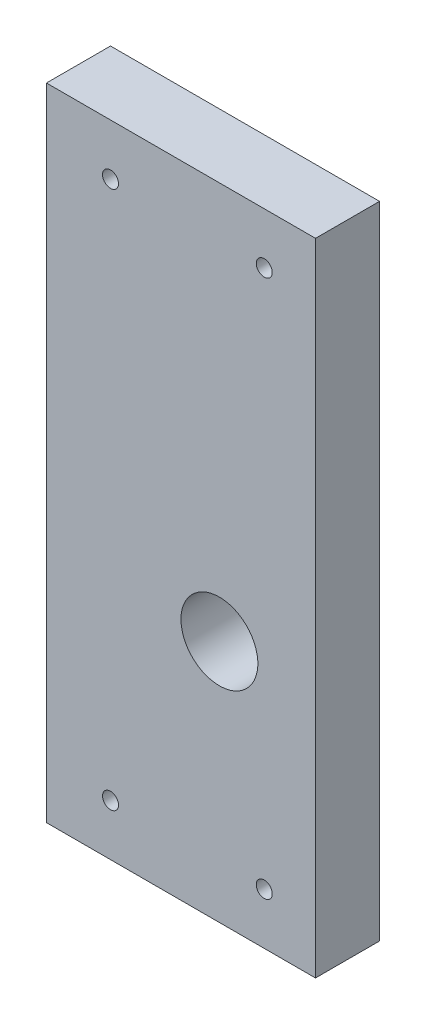
ISO-10303-21;
HEADER;
FILE_DESCRIPTION(('STEP AP214'),'2;1');
FILE_NAME('part.step','',(''),(''),'','','');
FILE_SCHEMA(('AUTOMOTIVE_DESIGN { 1 0 10303 214 1 1 1 1 }'));
ENDSEC;
DATA;
#1=APPLICATION_CONTEXT('core data for automotive mechanical design processes');
#2=APPLICATION_PROTOCOL_DEFINITION('international standard','automotive_design',2000,#1);
#3=PRODUCT_CONTEXT('',#1,'mechanical');
#4=PRODUCT('Part','Part','',(#3));
#5=PRODUCT_RELATED_PRODUCT_CATEGORY('part','',(#4));
#6=PRODUCT_DEFINITION_FORMATION('','',#4);
#7=PRODUCT_DEFINITION_CONTEXT('part definition',#1,'design');
#8=PRODUCT_DEFINITION('design','',#6,#7);
#9=PRODUCT_DEFINITION_SHAPE('','',#8);
#10=(LENGTH_UNIT() NAMED_UNIT(*) SI_UNIT(.MILLI.,.METRE.));
#11=(NAMED_UNIT(*) PLANE_ANGLE_UNIT() SI_UNIT($,.RADIAN.));
#12=(NAMED_UNIT(*) SI_UNIT($,.STERADIAN.) SOLID_ANGLE_UNIT());
#13=UNCERTAINTY_MEASURE_WITH_UNIT(LENGTH_MEASURE(1.E-05),#10,'distance_accuracy_value','');
#14=(GEOMETRIC_REPRESENTATION_CONTEXT(3) GLOBAL_UNCERTAINTY_ASSIGNED_CONTEXT((#13)) GLOBAL_UNIT_ASSIGNED_CONTEXT((#10,
#11,#12)) REPRESENTATION_CONTEXT('',''));
#15=CARTESIAN_POINT('',(0.,0.,0.));
#16=DIRECTION('',(0.,0.,1.));
#17=DIRECTION('',(1.,0.,0.));
#18=AXIS2_PLACEMENT_3D('',#15,#16,#17);
#19=CARTESIAN_POINT('',(21.,-50.,0.));
#20=DIRECTION('',(1.,0.,0.));
#21=DIRECTION('',(0.,0.,-1.));
#22=AXIS2_PLACEMENT_3D('',#19,#20,#21);
#23=PLANE('',#22);
#24=DIRECTION('',(0.,1.,0.));
#25=VECTOR('',#24,1.);
#26=CARTESIAN_POINT('',(21.,-50.,10.));
#27=LINE('',#26,#25);
#28=CARTESIAN_POINT('',(21.,-50.,10.));
#29=VERTEX_POINT('',#28);
#30=CARTESIAN_POINT('',(21.,50.,10.));
#31=VERTEX_POINT('',#30);
#32=EDGE_CURVE('E138',#29,#31,#27,.T.);
#33=ORIENTED_EDGE('',*,*,#32,.F.);
#34=DIRECTION('',(0.,0.,1.));
#35=VECTOR('',#34,1.);
#36=CARTESIAN_POINT('',(21.,-50.,0.));
#37=LINE('',#36,#35);
#38=CARTESIAN_POINT('',(21.,-50.,0.));
#39=VERTEX_POINT('',#38);
#40=EDGE_CURVE('E11',#39,#29,#37,.T.);
#41=ORIENTED_EDGE('',*,*,#40,.F.);
#42=DIRECTION('',(0.,1.,0.));
#43=VECTOR('',#42,1.);
#44=CARTESIAN_POINT('',(21.,-50.,0.));
#45=LINE('',#44,#43);
#46=CARTESIAN_POINT('',(21.,50.,0.));
#47=VERTEX_POINT('',#46);
#48=EDGE_CURVE('E139',#39,#47,#45,.T.);
#49=ORIENTED_EDGE('',*,*,#48,.T.);
#50=DIRECTION('',(0.,0.,1.));
#51=VECTOR('',#50,1.);
#52=CARTESIAN_POINT('',(21.,50.,0.));
#53=LINE('',#52,#51);
#54=EDGE_CURVE('E38',#47,#31,#53,.T.);
#55=ORIENTED_EDGE('',*,*,#54,.T.);
#56=EDGE_LOOP('',(#33,#41,#49,#55));
#57=FACE_BOUND('',#56,.T.);
#58=ADVANCED_FACE('F35',(#57),#23,.T.);
#59=CARTESIAN_POINT('',(-21.,-50.,0.));
#60=DIRECTION('',(0.,-1.,0.));
#61=DIRECTION('',(0.,0.,-1.));
#62=AXIS2_PLACEMENT_3D('',#59,#60,#61);
#63=PLANE('',#62);
#64=DIRECTION('',(1.,0.,0.));
#65=VECTOR('',#64,1.);
#66=CARTESIAN_POINT('',(-21.,-50.,10.));
#67=LINE('',#66,#65);
#68=CARTESIAN_POINT('',(-21.,-50.,10.));
#69=VERTEX_POINT('',#68);
#70=EDGE_CURVE('E142',#69,#29,#67,.T.);
#71=ORIENTED_EDGE('',*,*,#70,.F.);
#72=DIRECTION('',(0.,0.,1.));
#73=VECTOR('',#72,1.);
#74=CARTESIAN_POINT('',(-21.,-50.,0.));
#75=LINE('',#74,#73);
#76=CARTESIAN_POINT('',(-21.,-50.,0.));
#77=VERTEX_POINT('',#76);
#78=EDGE_CURVE('E44',#77,#69,#75,.T.);
#79=ORIENTED_EDGE('',*,*,#78,.F.);
#80=DIRECTION('',(1.,0.,0.));
#81=VECTOR('',#80,1.);
#82=CARTESIAN_POINT('',(-21.,-50.,0.));
#83=LINE('',#82,#81);
#84=EDGE_CURVE('E146',#77,#39,#83,.T.);
#85=ORIENTED_EDGE('',*,*,#84,.T.);
#86=ORIENTED_EDGE('',*,*,#40,.T.);
#87=EDGE_LOOP('',(#71,#79,#85,#86));
#88=FACE_BOUND('',#87,.T.);
#89=ADVANCED_FACE('F161',(#88),#63,.T.);
#90=CARTESIAN_POINT('',(-21.,50.,0.));
#91=DIRECTION('',(-1.,0.,0.));
#92=DIRECTION('',(0.,0.,1.));
#93=AXIS2_PLACEMENT_3D('',#90,#91,#92);
#94=PLANE('',#93);
#95=CARTESIAN_POINT('',(-21.,45.,5.));
#96=DIRECTION('',(-1.,0.,0.));
#97=DIRECTION('',(0.,0.,1.));
#98=AXIS2_PLACEMENT_3D('',#95,#96,#97);
#99=CIRCLE('',#98,1.24999999999999);
#100=CARTESIAN_POINT('',(-21.,45.,6.24999999999999));
#101=VERTEX_POINT('',#100);
#102=EDGE_CURVE('E98',#101,#101,#99,.T.);
#103=ORIENTED_EDGE('',*,*,#102,.F.);
#104=EDGE_LOOP('',(#103));
#105=FACE_BOUND('',#104,.T.);
#106=CARTESIAN_POINT('',(-21.,-45.,5.));
#107=DIRECTION('',(-1.,0.,0.));
#108=DIRECTION('',(0.,0.,1.));
#109=AXIS2_PLACEMENT_3D('',#106,#107,#108);
#110=CIRCLE('',#109,1.24999999999999);
#111=CARTESIAN_POINT('',(-21.,-45.,6.24999999999999));
#112=VERTEX_POINT('',#111);
#113=EDGE_CURVE('E97',#112,#112,#110,.T.);
#114=ORIENTED_EDGE('',*,*,#113,.F.);
#115=EDGE_LOOP('',(#114));
#116=FACE_BOUND('',#115,.T.);
#117=DIRECTION('',(0.,-1.,0.));
#118=VECTOR('',#117,1.);
#119=CARTESIAN_POINT('',(-21.,50.,10.));
#120=LINE('',#119,#118);
#121=CARTESIAN_POINT('',(-21.,50.,10.));
#122=VERTEX_POINT('',#121);
#123=EDGE_CURVE('E153',#122,#69,#120,.T.);
#124=ORIENTED_EDGE('',*,*,#123,.F.);
#125=DIRECTION('',(0.,0.,1.));
#126=VECTOR('',#125,1.);
#127=CARTESIAN_POINT('',(-21.,50.,0.));
#128=LINE('',#127,#126);
#129=CARTESIAN_POINT('',(-21.,50.,0.));
#130=VERTEX_POINT('',#129);
#131=EDGE_CURVE('E157',#130,#122,#128,.T.);
#132=ORIENTED_EDGE('',*,*,#131,.F.);
#133=DIRECTION('',(0.,-1.,0.));
#134=VECTOR('',#133,1.);
#135=CARTESIAN_POINT('',(-21.,50.,0.));
#136=LINE('',#135,#134);
#137=EDGE_CURVE('E144',#130,#77,#136,.T.);
#138=ORIENTED_EDGE('',*,*,#137,.T.);
#139=ORIENTED_EDGE('',*,*,#78,.T.);
#140=EDGE_LOOP('',(#124,#132,#138,#139));
#141=FACE_BOUND('',#140,.T.);
#142=ADVANCED_FACE('F164',(#105,#116,#141),#94,.T.);
#143=CARTESIAN_POINT('',(21.,50.,0.));
#144=DIRECTION('',(0.,1.,0.));
#145=DIRECTION('',(0.,0.,1.));
#146=AXIS2_PLACEMENT_3D('',#143,#144,#145);
#147=PLANE('',#146);
#148=DIRECTION('',(-1.,0.,0.));
#149=VECTOR('',#148,1.);
#150=CARTESIAN_POINT('',(21.,50.,10.));
#151=LINE('',#150,#149);
#152=EDGE_CURVE('E150',#31,#122,#151,.T.);
#153=ORIENTED_EDGE('',*,*,#152,.F.);
#154=ORIENTED_EDGE('',*,*,#54,.F.);
#155=DIRECTION('',(-1.,0.,0.));
#156=VECTOR('',#155,1.);
#157=CARTESIAN_POINT('',(21.,50.,0.));
#158=LINE('',#157,#156);
#159=EDGE_CURVE('E141',#47,#130,#158,.T.);
#160=ORIENTED_EDGE('',*,*,#159,.T.);
#161=ORIENTED_EDGE('',*,*,#131,.T.);
#162=EDGE_LOOP('',(#153,#154,#160,#161));
#163=FACE_BOUND('',#162,.T.);
#164=ADVANCED_FACE('F158',(#163),#147,.T.);
#165=CARTESIAN_POINT('',(0.,0.,0.));
#166=DIRECTION('',(0.,0.,1.));
#167=DIRECTION('',(1.,0.,0.));
#168=AXIS2_PLACEMENT_3D('',#165,#166,#167);
#169=PLANE('',#168);
#170=CARTESIAN_POINT('',(13.,42.,0.));
#171=DIRECTION('',(0.,0.,1.));
#172=DIRECTION('',(1.,0.,0.));
#173=AXIS2_PLACEMENT_3D('',#170,#171,#172);
#174=CIRCLE('',#173,1.24999999999998);
#175=CARTESIAN_POINT('',(14.25,42.,0.));
#176=VERTEX_POINT('',#175);
#177=EDGE_CURVE('E111',#176,#176,#174,.T.);
#178=ORIENTED_EDGE('',*,*,#177,.T.);
#179=EDGE_LOOP('',(#178));
#180=FACE_BOUND('',#179,.T.);
#181=CARTESIAN_POINT('',(-11.,42.,0.));
#182=DIRECTION('',(0.,0.,1.));
#183=DIRECTION('',(1.,0.,0.));
#184=AXIS2_PLACEMENT_3D('',#181,#182,#183);
#185=CIRCLE('',#184,1.24999999999998);
#186=CARTESIAN_POINT('',(-9.75000000000003,42.,0.));
#187=VERTEX_POINT('',#186);
#188=EDGE_CURVE('E117',#187,#187,#185,.T.);
#189=ORIENTED_EDGE('',*,*,#188,.T.);
#190=EDGE_LOOP('',(#189));
#191=FACE_BOUND('',#190,.T.);
#192=CARTESIAN_POINT('',(-11.,-42.,0.));
#193=DIRECTION('',(0.,0.,1.));
#194=DIRECTION('',(1.,0.,0.));
#195=AXIS2_PLACEMENT_3D('',#192,#193,#194);
#196=CIRCLE('',#195,1.24999999999998);
#197=CARTESIAN_POINT('',(-9.75000000000003,-42.,0.));
#198=VERTEX_POINT('',#197);
#199=EDGE_CURVE('E123',#198,#198,#196,.T.);
#200=ORIENTED_EDGE('',*,*,#199,.T.);
#201=EDGE_LOOP('',(#200));
#202=FACE_BOUND('',#201,.T.);
#203=CARTESIAN_POINT('',(13.,-42.,0.));
#204=DIRECTION('',(0.,0.,1.));
#205=DIRECTION('',(1.,0.,0.));
#206=AXIS2_PLACEMENT_3D('',#203,#204,#205);
#207=CIRCLE('',#206,1.24999999999998);
#208=CARTESIAN_POINT('',(14.25,-42.,0.));
#209=VERTEX_POINT('',#208);
#210=EDGE_CURVE('E129',#209,#209,#207,.T.);
#211=ORIENTED_EDGE('',*,*,#210,.T.);
#212=EDGE_LOOP('',(#211));
#213=FACE_BOUND('',#212,.T.);
#214=CARTESIAN_POINT('',(5.99999999999999,-12.,0.));
#215=DIRECTION('',(0.,0.,-1.));
#216=DIRECTION('',(-1.,0.,0.));
#217=AXIS2_PLACEMENT_3D('',#214,#215,#216);
#218=CIRCLE('',#217,5.99999999999999);
#219=CARTESIAN_POINT('',(0.,-12.,0.));
#220=VERTEX_POINT('',#219);
#221=EDGE_CURVE('E132',#220,#220,#218,.T.);
#222=ORIENTED_EDGE('',*,*,#221,.F.);
#223=EDGE_LOOP('',(#222));
#224=FACE_BOUND('',#223,.T.);
#225=ORIENTED_EDGE('',*,*,#48,.F.);
#226=ORIENTED_EDGE('',*,*,#84,.F.);
#227=ORIENTED_EDGE('',*,*,#137,.F.);
#228=ORIENTED_EDGE('',*,*,#159,.F.);
#229=EDGE_LOOP('',(#225,#226,#227,#228));
#230=FACE_BOUND('',#229,.T.);
#231=ADVANCED_FACE('F166',(#180,#191,#202,#213,#224,#230),#169,.F.);
#232=CARTESIAN_POINT('',(0.,0.,10.));
#233=DIRECTION('',(0.,0.,1.));
#234=DIRECTION('',(1.,0.,0.));
#235=AXIS2_PLACEMENT_3D('',#232,#233,#234);
#236=PLANE('',#235);
#237=CARTESIAN_POINT('',(13.,42.,10.));
#238=DIRECTION('',(0.,0.,1.));
#239=DIRECTION('',(1.,0.,0.));
#240=AXIS2_PLACEMENT_3D('',#237,#238,#239);
#241=CIRCLE('',#240,1.24999999999998);
#242=CARTESIAN_POINT('',(14.25,42.,10.));
#243=VERTEX_POINT('',#242);
#244=EDGE_CURVE('E108',#243,#243,#241,.T.);
#245=ORIENTED_EDGE('',*,*,#244,.F.);
#246=EDGE_LOOP('',(#245));
#247=FACE_BOUND('',#246,.T.);
#248=CARTESIAN_POINT('',(-11.,42.,10.));
#249=DIRECTION('',(0.,0.,1.));
#250=DIRECTION('',(1.,0.,0.));
#251=AXIS2_PLACEMENT_3D('',#248,#249,#250);
#252=CIRCLE('',#251,1.24999999999998);
#253=CARTESIAN_POINT('',(-9.75000000000002,42.,10.));
#254=VERTEX_POINT('',#253);
#255=EDGE_CURVE('E114',#254,#254,#252,.T.);
#256=ORIENTED_EDGE('',*,*,#255,.F.);
#257=EDGE_LOOP('',(#256));
#258=FACE_BOUND('',#257,.T.);
#259=CARTESIAN_POINT('',(-11.,-42.,10.));
#260=DIRECTION('',(0.,0.,1.));
#261=DIRECTION('',(1.,0.,0.));
#262=AXIS2_PLACEMENT_3D('',#259,#260,#261);
#263=CIRCLE('',#262,1.24999999999998);
#264=CARTESIAN_POINT('',(-9.75000000000003,-42.,10.));
#265=VERTEX_POINT('',#264);
#266=EDGE_CURVE('E120',#265,#265,#263,.T.);
#267=ORIENTED_EDGE('',*,*,#266,.F.);
#268=EDGE_LOOP('',(#267));
#269=FACE_BOUND('',#268,.T.);
#270=CARTESIAN_POINT('',(13.,-42.,10.));
#271=DIRECTION('',(0.,0.,1.));
#272=DIRECTION('',(1.,0.,0.));
#273=AXIS2_PLACEMENT_3D('',#270,#271,#272);
#274=CIRCLE('',#273,1.24999999999998);
#275=CARTESIAN_POINT('',(14.25,-42.,10.));
#276=VERTEX_POINT('',#275);
#277=EDGE_CURVE('E126',#276,#276,#274,.T.);
#278=ORIENTED_EDGE('',*,*,#277,.F.);
#279=EDGE_LOOP('',(#278));
#280=FACE_BOUND('',#279,.T.);
#281=CARTESIAN_POINT('',(5.99999999999999,-12.,9.99999999999999));
#282=DIRECTION('',(0.,0.,-1.));
#283=DIRECTION('',(-1.,0.,0.));
#284=AXIS2_PLACEMENT_3D('',#281,#282,#283);
#285=CIRCLE('',#284,5.99999999999999);
#286=CARTESIAN_POINT('',(0.,-12.,9.99999999999999));
#287=VERTEX_POINT('',#286);
#288=EDGE_CURVE('E135',#287,#287,#285,.T.);
#289=ORIENTED_EDGE('',*,*,#288,.T.);
#290=EDGE_LOOP('',(#289));
#291=FACE_BOUND('',#290,.T.);
#292=ORIENTED_EDGE('',*,*,#32,.T.);
#293=ORIENTED_EDGE('',*,*,#152,.T.);
#294=ORIENTED_EDGE('',*,*,#123,.T.);
#295=ORIENTED_EDGE('',*,*,#70,.T.);
#296=EDGE_LOOP('',(#292,#293,#294,#295));
#297=FACE_BOUND('',#296,.T.);
#298=ADVANCED_FACE('F160',(#247,#258,#269,#280,#291,#297),#236,.T.);
#299=CARTESIAN_POINT('',(5.99999999999999,-12.,0.));
#300=DIRECTION('',(0.,0.,-1.));
#301=DIRECTION('',(-1.,0.,0.));
#302=AXIS2_PLACEMENT_3D('',#299,#300,#301);
#303=CYLINDRICAL_SURFACE('',#302,5.99999999999999);
#304=ORIENTED_EDGE('',*,*,#288,.F.);
#305=EDGE_LOOP('',(#304));
#306=FACE_BOUND('',#305,.T.);
#307=ORIENTED_EDGE('',*,*,#221,.T.);
#308=EDGE_LOOP('',(#307));
#309=FACE_BOUND('',#308,.T.);
#310=ADVANCED_FACE('F174',(#306,#309),#303,.F.);
#311=CARTESIAN_POINT('',(13.,-42.,10.));
#312=DIRECTION('',(0.,0.,1.));
#313=DIRECTION('',(1.,0.,0.));
#314=AXIS2_PLACEMENT_3D('',#311,#312,#313);
#315=CYLINDRICAL_SURFACE('',#314,1.24999999999998);
#316=ORIENTED_EDGE('',*,*,#210,.F.);
#317=EDGE_LOOP('',(#316));
#318=FACE_BOUND('',#317,.T.);
#319=ORIENTED_EDGE('',*,*,#277,.T.);
#320=EDGE_LOOP('',(#319));
#321=FACE_BOUND('',#320,.T.);
#322=ADVANCED_FACE('F218',(#318,#321),#315,.F.);
#323=CARTESIAN_POINT('',(-11.,-42.,10.));
#324=DIRECTION('',(0.,0.,1.));
#325=DIRECTION('',(1.,0.,0.));
#326=AXIS2_PLACEMENT_3D('',#323,#324,#325);
#327=CYLINDRICAL_SURFACE('',#326,1.24999999999998);
#328=ORIENTED_EDGE('',*,*,#199,.F.);
#329=EDGE_LOOP('',(#328));
#330=FACE_BOUND('',#329,.T.);
#331=ORIENTED_EDGE('',*,*,#266,.T.);
#332=EDGE_LOOP('',(#331));
#333=FACE_BOUND('',#332,.T.);
#334=ADVANCED_FACE('F214',(#330,#333),#327,.F.);
#335=CARTESIAN_POINT('',(-11.,42.,10.));
#336=DIRECTION('',(0.,0.,1.));
#337=DIRECTION('',(1.,0.,0.));
#338=AXIS2_PLACEMENT_3D('',#335,#336,#337);
#339=CYLINDRICAL_SURFACE('',#338,1.24999999999998);
#340=ORIENTED_EDGE('',*,*,#188,.F.);
#341=EDGE_LOOP('',(#340));
#342=FACE_BOUND('',#341,.T.);
#343=ORIENTED_EDGE('',*,*,#255,.T.);
#344=EDGE_LOOP('',(#343));
#345=FACE_BOUND('',#344,.T.);
#346=ADVANCED_FACE('F210',(#342,#345),#339,.F.);
#347=CARTESIAN_POINT('',(13.,42.,10.));
#348=DIRECTION('',(0.,0.,1.));
#349=DIRECTION('',(1.,0.,0.));
#350=AXIS2_PLACEMENT_3D('',#347,#348,#349);
#351=CYLINDRICAL_SURFACE('',#350,1.24999999999998);
#352=ORIENTED_EDGE('',*,*,#177,.F.);
#353=EDGE_LOOP('',(#352));
#354=FACE_BOUND('',#353,.T.);
#355=ORIENTED_EDGE('',*,*,#244,.T.);
#356=EDGE_LOOP('',(#355));
#357=FACE_BOUND('',#356,.T.);
#358=ADVANCED_FACE('F202',(#354,#357),#351,.F.);
#359=CARTESIAN_POINT('',(-13.5,-45.,5.));
#360=DIRECTION('',(-1.,0.,0.));
#361=DIRECTION('',(0.,0.,1.));
#362=AXIS2_PLACEMENT_3D('',#359,#360,#361);
#363=CONICAL_SURFACE('',#362,1.24999999999999,1.02974425863857);
#364=CARTESIAN_POINT('',(-12.7489242261508,-45.,5.));
#365=VERTEX_POINT('',#364);
#366=VERTEX_LOOP('',#365);
#367=FACE_BOUND('',#366,.T.);
#368=CARTESIAN_POINT('',(-13.5,-45.,5.));
#369=DIRECTION('',(-1.,0.,0.));
#370=DIRECTION('',(0.,0.,1.));
#371=AXIS2_PLACEMENT_3D('',#368,#369,#370);
#372=CIRCLE('',#371,1.24999999999999);
#373=CARTESIAN_POINT('',(-13.5,-45.,6.24999999999999));
#374=VERTEX_POINT('',#373);
#375=EDGE_CURVE('E101',#374,#374,#372,.T.);
#376=ORIENTED_EDGE('',*,*,#375,.T.);
#377=EDGE_LOOP('',(#376));
#378=FACE_BOUND('',#377,.T.);
#379=ADVANCED_FACE('F196',(#367,#378),#363,.F.);
#380=CARTESIAN_POINT('',(-21.,-45.,5.));
#381=DIRECTION('',(-1.,0.,0.));
#382=DIRECTION('',(0.,0.,1.));
#383=AXIS2_PLACEMENT_3D('',#380,#381,#382);
#384=CYLINDRICAL_SURFACE('',#383,1.24999999999999);
#385=ORIENTED_EDGE('',*,*,#375,.F.);
#386=EDGE_LOOP('',(#385));
#387=FACE_BOUND('',#386,.T.);
#388=ORIENTED_EDGE('',*,*,#113,.T.);
#389=EDGE_LOOP('',(#388));
#390=FACE_BOUND('',#389,.T.);
#391=ADVANCED_FACE('F91',(#387,#390),#384,.F.);
#392=CARTESIAN_POINT('',(-13.5,45.,5.));
#393=DIRECTION('',(-1.,0.,0.));
#394=DIRECTION('',(0.,0.,1.));
#395=AXIS2_PLACEMENT_3D('',#392,#393,#394);
#396=CONICAL_SURFACE('',#395,1.24999999999999,1.02974425863857);
#397=CARTESIAN_POINT('',(-12.7489242261508,45.,5.));
#398=VERTEX_POINT('',#397);
#399=VERTEX_LOOP('',#398);
#400=FACE_BOUND('',#399,.T.);
#401=CARTESIAN_POINT('',(-13.5,45.,5.));
#402=DIRECTION('',(-1.,0.,0.));
#403=DIRECTION('',(0.,0.,1.));
#404=AXIS2_PLACEMENT_3D('',#401,#402,#403);
#405=CIRCLE('',#404,1.24999999999999);
#406=CARTESIAN_POINT('',(-13.5,45.,6.24999999999999));
#407=VERTEX_POINT('',#406);
#408=EDGE_CURVE('E95',#407,#407,#405,.T.);
#409=ORIENTED_EDGE('',*,*,#408,.T.);
#410=EDGE_LOOP('',(#409));
#411=FACE_BOUND('',#410,.T.);
#412=ADVANCED_FACE('F87',(#400,#411),#396,.F.);
#413=CARTESIAN_POINT('',(-21.,45.,5.));
#414=DIRECTION('',(-1.,0.,0.));
#415=DIRECTION('',(0.,0.,1.));
#416=AXIS2_PLACEMENT_3D('',#413,#414,#415);
#417=CYLINDRICAL_SURFACE('',#416,1.24999999999999);
#418=ORIENTED_EDGE('',*,*,#408,.F.);
#419=EDGE_LOOP('',(#418));
#420=FACE_BOUND('',#419,.T.);
#421=ORIENTED_EDGE('',*,*,#102,.T.);
#422=EDGE_LOOP('',(#421));
#423=FACE_BOUND('',#422,.T.);
#424=ADVANCED_FACE('F90',(#420,#423),#417,.F.);
#425=CLOSED_SHELL('',(#58,#89,#142,#164,#231,#298,#310,#322,#334,#346,#358,#379,#391,#412,#424));
#426=MANIFOLD_SOLID_BREP('B2',#425);
#427=ADVANCED_BREP_SHAPE_REPRESENTATION('',(#18,#426),#14);
#428=SHAPE_DEFINITION_REPRESENTATION(#9,#427);
ENDSEC;
END-ISO-10303-21;
